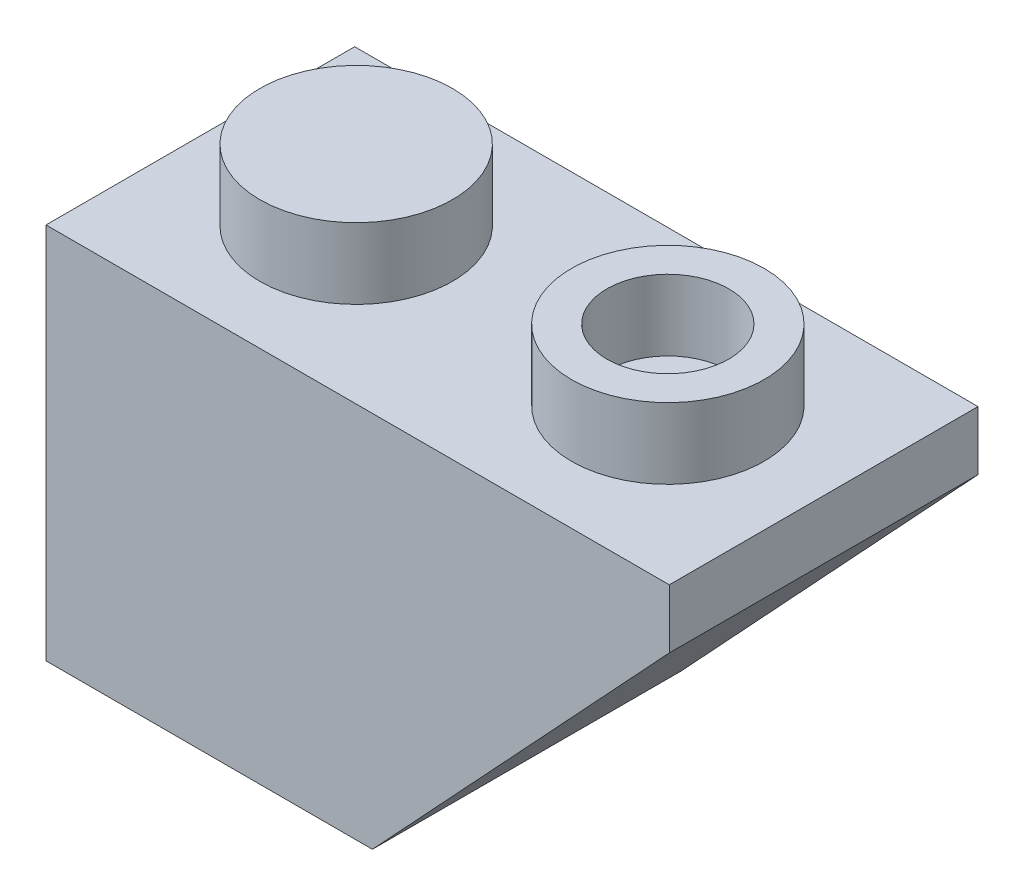
ISO-10303-21;
HEADER;
FILE_DESCRIPTION(('STEP AP214'),'2;1');
FILE_NAME('part.step','',(''),(''),'','','');
FILE_SCHEMA(('AUTOMOTIVE_DESIGN { 1 0 10303 214 1 1 1 1 }'));
ENDSEC;
DATA;
#1=APPLICATION_CONTEXT('core data for automotive mechanical design processes');
#2=APPLICATION_PROTOCOL_DEFINITION('international standard','automotive_design',2000,#1);
#3=PRODUCT_CONTEXT('',#1,'mechanical');
#4=PRODUCT('Part','Part','',(#3));
#5=PRODUCT_RELATED_PRODUCT_CATEGORY('part','',(#4));
#6=PRODUCT_DEFINITION_FORMATION('','',#4);
#7=PRODUCT_DEFINITION_CONTEXT('part definition',#1,'design');
#8=PRODUCT_DEFINITION('design','',#6,#7);
#9=PRODUCT_DEFINITION_SHAPE('','',#8);
#10=(LENGTH_UNIT() NAMED_UNIT(*) SI_UNIT(.MILLI.,.METRE.));
#11=(NAMED_UNIT(*) PLANE_ANGLE_UNIT() SI_UNIT($,.RADIAN.));
#12=(NAMED_UNIT(*) SI_UNIT($,.STERADIAN.) SOLID_ANGLE_UNIT());
#13=UNCERTAINTY_MEASURE_WITH_UNIT(LENGTH_MEASURE(1.E-05),#10,'distance_accuracy_value','');
#14=(GEOMETRIC_REPRESENTATION_CONTEXT(3) GLOBAL_UNCERTAINTY_ASSIGNED_CONTEXT((#13)) GLOBAL_UNIT_ASSIGNED_CONTEXT((#10,
#11,#12)) REPRESENTATION_CONTEXT('',''));
#15=CARTESIAN_POINT('',(0.,0.,0.));
#16=DIRECTION('',(0.,0.,1.));
#17=DIRECTION('',(1.,0.,0.));
#18=AXIS2_PLACEMENT_3D('',#15,#16,#17);
#19=CARTESIAN_POINT('',(15.85,9.6,-7.85));
#20=DIRECTION('',(0.,1.,0.));
#21=DIRECTION('',(0.,0.,1.));
#22=AXIS2_PLACEMENT_3D('',#19,#20,#21);
#23=PLANE('',#22);
#24=CARTESIAN_POINT('',(11.8875,9.6,-3.925));
#25=DIRECTION('',(0.,1.,0.));
#26=DIRECTION('',(0.,0.,1.));
#27=AXIS2_PLACEMENT_3D('',#24,#25,#26);
#28=CIRCLE('',#27,2.45);
#29=CARTESIAN_POINT('',(11.8875,9.6,-1.475));
#30=VERTEX_POINT('',#29);
#31=EDGE_CURVE('E225',#30,#30,#28,.T.);
#32=ORIENTED_EDGE('',*,*,#31,.F.);
#33=EDGE_LOOP('',(#32));
#34=FACE_BOUND('',#33,.T.);
#35=CARTESIAN_POINT('',(3.9625,9.6,-3.925));
#36=DIRECTION('',(0.,1.,0.));
#37=DIRECTION('',(0.,0.,1.));
#38=AXIS2_PLACEMENT_3D('',#35,#36,#37);
#39=CIRCLE('',#38,2.45);
#40=CARTESIAN_POINT('',(3.9625,9.6,-1.475));
#41=VERTEX_POINT('',#40);
#42=EDGE_CURVE('E232',#41,#41,#39,.T.);
#43=ORIENTED_EDGE('',*,*,#42,.F.);
#44=EDGE_LOOP('',(#43));
#45=FACE_BOUND('',#44,.T.);
#46=DIRECTION('',(-1.,0.,0.));
#47=VECTOR('',#46,1.);
#48=CARTESIAN_POINT('',(15.85,9.6,0.));
#49=LINE('',#48,#47);
#50=CARTESIAN_POINT('',(15.85,9.6,0.));
#51=VERTEX_POINT('',#50);
#52=CARTESIAN_POINT('',(0.,9.6,0.));
#53=VERTEX_POINT('',#52);
#54=EDGE_CURVE('E126',#51,#53,#49,.T.);
#55=ORIENTED_EDGE('',*,*,#54,.F.);
#56=DIRECTION('',(0.,0.,1.));
#57=VECTOR('',#56,1.);
#58=CARTESIAN_POINT('',(15.85,9.6,-7.85));
#59=LINE('',#58,#57);
#60=CARTESIAN_POINT('',(15.85,9.6,-7.85));
#61=VERTEX_POINT('',#60);
#62=EDGE_CURVE('E42',#61,#51,#59,.T.);
#63=ORIENTED_EDGE('',*,*,#62,.F.);
#64=DIRECTION('',(-1.,0.,0.));
#65=VECTOR('',#64,1.);
#66=CARTESIAN_POINT('',(15.85,9.6,-7.85));
#67=LINE('',#66,#65);
#68=CARTESIAN_POINT('',(0.,9.6,-7.85));
#69=VERTEX_POINT('',#68);
#70=EDGE_CURVE('E121',#61,#69,#67,.T.);
#71=ORIENTED_EDGE('',*,*,#70,.T.);
#72=DIRECTION('',(0.,0.,1.));
#73=VECTOR('',#72,1.);
#74=CARTESIAN_POINT('',(0.,9.6,-7.85));
#75=LINE('',#74,#73);
#76=EDGE_CURVE('E87',#69,#53,#75,.T.);
#77=ORIENTED_EDGE('',*,*,#76,.T.);
#78=EDGE_LOOP('',(#55,#63,#71,#77));
#79=FACE_BOUND('',#78,.T.);
#80=ADVANCED_FACE('F35',(#34,#45,#79),#23,.T.);
#81=CARTESIAN_POINT('',(15.85,8.1,-7.85));
#82=DIRECTION('',(1.,0.,0.));
#83=DIRECTION('',(0.,0.,-1.));
#84=AXIS2_PLACEMENT_3D('',#81,#82,#83);
#85=PLANE('',#84);
#86=DIRECTION('',(0.,1.,0.));
#87=VECTOR('',#86,1.);
#88=CARTESIAN_POINT('',(15.85,8.1,0.));
#89=LINE('',#88,#87);
#90=CARTESIAN_POINT('',(15.85,8.1,0.));
#91=VERTEX_POINT('',#90);
#92=EDGE_CURVE('E136',#91,#51,#89,.T.);
#93=ORIENTED_EDGE('',*,*,#92,.F.);
#94=DIRECTION('',(0.,0.,1.));
#95=VECTOR('',#94,1.);
#96=CARTESIAN_POINT('',(15.85,8.1,-7.85));
#97=LINE('',#96,#95);
#98=CARTESIAN_POINT('',(15.85,8.1,-7.85));
#99=VERTEX_POINT('',#98);
#100=EDGE_CURVE('E109',#99,#91,#97,.T.);
#101=ORIENTED_EDGE('',*,*,#100,.F.);
#102=DIRECTION('',(0.,1.,0.));
#103=VECTOR('',#102,1.);
#104=CARTESIAN_POINT('',(15.85,8.1,-7.85));
#105=LINE('',#104,#103);
#106=EDGE_CURVE('E116',#99,#61,#105,.T.);
#107=ORIENTED_EDGE('',*,*,#106,.T.);
#108=ORIENTED_EDGE('',*,*,#62,.T.);
#109=EDGE_LOOP('',(#93,#101,#107,#108));
#110=FACE_BOUND('',#109,.T.);
#111=ADVANCED_FACE('F144',(#110),#85,.T.);
#112=CARTESIAN_POINT('',(8.3,0.,-7.85));
#113=DIRECTION('',(0.731505583015936,-0.681835450835841,0.));
#114=DIRECTION('',(0.681835450835842,0.731505583015936,0.));
#115=AXIS2_PLACEMENT_3D('',#112,#113,#114);
#116=PLANE('',#115);
#117=DIRECTION('',(0.681835450835842,0.731505583015936,0.));
#118=VECTOR('',#117,1.);
#119=CARTESIAN_POINT('',(8.3,0.,0.));
#120=LINE('',#119,#118);
#121=CARTESIAN_POINT('',(8.3,0.,0.));
#122=VERTEX_POINT('',#121);
#123=EDGE_CURVE('E104',#122,#91,#120,.T.);
#124=ORIENTED_EDGE('',*,*,#123,.F.);
#125=DIRECTION('',(0.,0.,1.));
#126=VECTOR('',#125,1.);
#127=CARTESIAN_POINT('',(8.3,0.,-7.85));
#128=LINE('',#127,#126);
#129=CARTESIAN_POINT('',(8.3,0.,-7.85));
#130=VERTEX_POINT('',#129);
#131=EDGE_CURVE('E98',#130,#122,#128,.T.);
#132=ORIENTED_EDGE('',*,*,#131,.F.);
#133=DIRECTION('',(0.681835450835842,0.731505583015936,0.));
#134=VECTOR('',#133,1.);
#135=CARTESIAN_POINT('',(8.3,0.,-7.85));
#136=LINE('',#135,#134);
#137=EDGE_CURVE('E101',#130,#99,#136,.T.);
#138=ORIENTED_EDGE('',*,*,#137,.T.);
#139=ORIENTED_EDGE('',*,*,#100,.T.);
#140=EDGE_LOOP('',(#124,#132,#138,#139));
#141=FACE_BOUND('',#140,.T.);
#142=ADVANCED_FACE('F100',(#141),#116,.T.);
#143=CARTESIAN_POINT('',(0.,0.,-7.85));
#144=DIRECTION('',(0.,-1.,0.));
#145=DIRECTION('',(0.,0.,-1.));
#146=AXIS2_PLACEMENT_3D('',#143,#144,#145);
#147=PLANE('',#146);
#148=DIRECTION('',(0.,0.,-1.));
#149=VECTOR('',#148,1.);
#150=CARTESIAN_POINT('',(1.5,0.,-1.5));
#151=LINE('',#150,#149);
#152=CARTESIAN_POINT('',(1.5,0.,-1.5));
#153=VERTEX_POINT('',#152);
#154=CARTESIAN_POINT('',(1.5,0.,-6.35));
#155=VERTEX_POINT('',#154);
#156=EDGE_CURVE('E246',#153,#155,#151,.T.);
#157=ORIENTED_EDGE('',*,*,#156,.F.);
#158=DIRECTION('',(-1.,0.,0.));
#159=VECTOR('',#158,1.);
#160=CARTESIAN_POINT('',(1.5,0.,-1.5));
#161=LINE('',#160,#159);
#162=CARTESIAN_POINT('',(6.8,0.,-1.5));
#163=VERTEX_POINT('',#162);
#164=EDGE_CURVE('E238',#163,#153,#161,.T.);
#165=ORIENTED_EDGE('',*,*,#164,.F.);
#166=DIRECTION('',(0.,0.,1.));
#167=VECTOR('',#166,1.);
#168=CARTESIAN_POINT('',(6.8,0.,-1.5));
#169=LINE('',#168,#167);
#170=CARTESIAN_POINT('',(6.8,0.,-6.35));
#171=VERTEX_POINT('',#170);
#172=EDGE_CURVE('E49',#171,#163,#169,.T.);
#173=ORIENTED_EDGE('',*,*,#172,.F.);
#174=DIRECTION('',(1.,0.,0.));
#175=VECTOR('',#174,1.);
#176=CARTESIAN_POINT('',(1.5,0.,-6.35));
#177=LINE('',#176,#175);
#178=EDGE_CURVE('E243',#155,#171,#177,.T.);
#179=ORIENTED_EDGE('',*,*,#178,.F.);
#180=EDGE_LOOP('',(#157,#165,#173,#179));
#181=FACE_BOUND('',#180,.T.);
#182=DIRECTION('',(1.,0.,0.));
#183=VECTOR('',#182,1.);
#184=CARTESIAN_POINT('',(0.,0.,0.));
#185=LINE('',#184,#183);
#186=CARTESIAN_POINT('',(0.,0.,0.));
#187=VERTEX_POINT('',#186);
#188=EDGE_CURVE('E133',#187,#122,#185,.T.);
#189=ORIENTED_EDGE('',*,*,#188,.F.);
#190=DIRECTION('',(0.,0.,1.));
#191=VECTOR('',#190,1.);
#192=CARTESIAN_POINT('',(0.,0.,-7.85));
#193=LINE('',#192,#191);
#194=CARTESIAN_POINT('',(0.,0.,-7.85));
#195=VERTEX_POINT('',#194);
#196=EDGE_CURVE('E110',#195,#187,#193,.T.);
#197=ORIENTED_EDGE('',*,*,#196,.F.);
#198=DIRECTION('',(1.,0.,0.));
#199=VECTOR('',#198,1.);
#200=CARTESIAN_POINT('',(0.,0.,-7.85));
#201=LINE('',#200,#199);
#202=EDGE_CURVE('E115',#195,#130,#201,.T.);
#203=ORIENTED_EDGE('',*,*,#202,.T.);
#204=ORIENTED_EDGE('',*,*,#131,.T.);
#205=EDGE_LOOP('',(#189,#197,#203,#204));
#206=FACE_BOUND('',#205,.T.);
#207=ADVANCED_FACE('F118',(#181,#206),#147,.T.);
#208=CARTESIAN_POINT('',(0.,9.6,-7.85));
#209=DIRECTION('',(-1.,0.,0.));
#210=DIRECTION('',(0.,0.,1.));
#211=AXIS2_PLACEMENT_3D('',#208,#209,#210);
#212=PLANE('',#211);
#213=DIRECTION('',(0.,-1.,0.));
#214=VECTOR('',#213,1.);
#215=CARTESIAN_POINT('',(0.,9.6,0.));
#216=LINE('',#215,#214);
#217=EDGE_CURVE('E129',#53,#187,#216,.T.);
#218=ORIENTED_EDGE('',*,*,#217,.F.);
#219=ORIENTED_EDGE('',*,*,#76,.F.);
#220=DIRECTION('',(0.,-1.,0.));
#221=VECTOR('',#220,1.);
#222=CARTESIAN_POINT('',(0.,9.6,-7.85));
#223=LINE('',#222,#221);
#224=EDGE_CURVE('E119',#69,#195,#223,.T.);
#225=ORIENTED_EDGE('',*,*,#224,.T.);
#226=ORIENTED_EDGE('',*,*,#196,.T.);
#227=EDGE_LOOP('',(#218,#219,#225,#226));
#228=FACE_BOUND('',#227,.T.);
#229=ADVANCED_FACE('F141',(#228),#212,.T.);
#230=CARTESIAN_POINT('',(0.,0.,-7.85));
#231=DIRECTION('',(0.,0.,1.));
#232=DIRECTION('',(1.,0.,0.));
#233=AXIS2_PLACEMENT_3D('',#230,#231,#232);
#234=PLANE('',#233);
#235=ORIENTED_EDGE('',*,*,#70,.F.);
#236=ORIENTED_EDGE('',*,*,#106,.F.);
#237=ORIENTED_EDGE('',*,*,#137,.F.);
#238=ORIENTED_EDGE('',*,*,#202,.F.);
#239=ORIENTED_EDGE('',*,*,#224,.F.);
#240=EDGE_LOOP('',(#235,#236,#237,#238,#239));
#241=FACE_BOUND('',#240,.T.);
#242=ADVANCED_FACE('F114',(#241),#234,.F.);
#243=CARTESIAN_POINT('',(0.,0.,0.));
#244=DIRECTION('',(0.,0.,1.));
#245=DIRECTION('',(1.,0.,0.));
#246=AXIS2_PLACEMENT_3D('',#243,#244,#245);
#247=PLANE('',#246);
#248=ORIENTED_EDGE('',*,*,#54,.T.);
#249=ORIENTED_EDGE('',*,*,#217,.T.);
#250=ORIENTED_EDGE('',*,*,#188,.T.);
#251=ORIENTED_EDGE('',*,*,#123,.T.);
#252=ORIENTED_EDGE('',*,*,#92,.T.);
#253=EDGE_LOOP('',(#248,#249,#250,#251,#252));
#254=FACE_BOUND('',#253,.T.);
#255=ADVANCED_FACE('F143',(#254),#247,.T.);
#256=CARTESIAN_POINT('',(15.85,8.1,-7.85));
#257=DIRECTION('',(0.,1.,0.));
#258=DIRECTION('',(0.,0.,1.));
#259=AXIS2_PLACEMENT_3D('',#256,#257,#258);
#260=PLANE('',#259);
#261=CARTESIAN_POINT('',(3.9625,8.1,-3.925));
#262=DIRECTION('',(0.,-1.,0.));
#263=DIRECTION('',(0.,0.,-1.));
#264=AXIS2_PLACEMENT_3D('',#261,#262,#263);
#265=CIRCLE('',#264,0.95);
#266=CARTESIAN_POINT('',(3.9625,8.1,-4.875));
#267=VERTEX_POINT('',#266);
#268=EDGE_CURVE('E218',#267,#267,#265,.T.);
#269=ORIENTED_EDGE('',*,*,#268,.F.);
#270=EDGE_LOOP('',(#269));
#271=FACE_BOUND('',#270,.T.);
#272=DIRECTION('',(-1.,0.,0.));
#273=VECTOR('',#272,1.);
#274=CARTESIAN_POINT('',(1.5,8.1,-1.5));
#275=LINE('',#274,#273);
#276=CARTESIAN_POINT('',(6.8,8.1,-1.5));
#277=VERTEX_POINT('',#276);
#278=CARTESIAN_POINT('',(1.5,8.1,-1.5));
#279=VERTEX_POINT('',#278);
#280=EDGE_CURVE('E254',#277,#279,#275,.T.);
#281=ORIENTED_EDGE('',*,*,#280,.T.);
#282=DIRECTION('',(0.,0.,-1.));
#283=VECTOR('',#282,1.);
#284=CARTESIAN_POINT('',(1.5,8.1,-1.5));
#285=LINE('',#284,#283);
#286=CARTESIAN_POINT('',(1.5,8.1,-6.35));
#287=VERTEX_POINT('',#286);
#288=EDGE_CURVE('E242',#279,#287,#285,.T.);
#289=ORIENTED_EDGE('',*,*,#288,.T.);
#290=DIRECTION('',(1.,0.,0.));
#291=VECTOR('',#290,1.);
#292=CARTESIAN_POINT('',(1.5,8.1,-6.35));
#293=LINE('',#292,#291);
#294=CARTESIAN_POINT('',(6.8,8.1,-6.35));
#295=VERTEX_POINT('',#294);
#296=EDGE_CURVE('E262',#287,#295,#293,.T.);
#297=ORIENTED_EDGE('',*,*,#296,.T.);
#298=DIRECTION('',(0.,0.,1.));
#299=VECTOR('',#298,1.);
#300=CARTESIAN_POINT('',(6.8,8.1,-1.5));
#301=LINE('',#300,#299);
#302=EDGE_CURVE('E258',#295,#277,#301,.T.);
#303=ORIENTED_EDGE('',*,*,#302,.T.);
#304=EDGE_LOOP('',(#281,#289,#297,#303));
#305=FACE_BOUND('',#304,.T.);
#306=ADVANCED_FACE('F166',(#271,#305),#260,.F.);
#307=CARTESIAN_POINT('',(1.5,16.7841840176877,-1.5));
#308=DIRECTION('',(-1.,0.,0.));
#309=DIRECTION('',(0.,0.,1.));
#310=AXIS2_PLACEMENT_3D('',#307,#308,#309);
#311=PLANE('',#310);
#312=DIRECTION('',(0.,-1.,0.));
#313=VECTOR('',#312,1.);
#314=CARTESIAN_POINT('',(1.5,16.7841840176877,-1.5));
#315=LINE('',#314,#313);
#316=EDGE_CURVE('E130',#279,#153,#315,.T.);
#317=ORIENTED_EDGE('',*,*,#316,.T.);
#318=ORIENTED_EDGE('',*,*,#156,.T.);
#319=DIRECTION('',(0.,-1.,0.));
#320=VECTOR('',#319,1.);
#321=CARTESIAN_POINT('',(1.5,16.7841840176877,-6.35));
#322=LINE('',#321,#320);
#323=EDGE_CURVE('E253',#287,#155,#322,.T.);
#324=ORIENTED_EDGE('',*,*,#323,.F.);
#325=ORIENTED_EDGE('',*,*,#288,.F.);
#326=EDGE_LOOP('',(#317,#318,#324,#325));
#327=FACE_BOUND('',#326,.T.);
#328=ADVANCED_FACE('F170',(#327),#311,.F.);
#329=CARTESIAN_POINT('',(1.5,16.7841840176877,-6.35));
#330=DIRECTION('',(0.,0.,-1.));
#331=DIRECTION('',(-1.,0.,0.));
#332=AXIS2_PLACEMENT_3D('',#329,#330,#331);
#333=PLANE('',#332);
#334=ORIENTED_EDGE('',*,*,#323,.T.);
#335=ORIENTED_EDGE('',*,*,#178,.T.);
#336=DIRECTION('',(0.,-1.,0.));
#337=VECTOR('',#336,1.);
#338=CARTESIAN_POINT('',(6.8,16.7841840176877,-6.35));
#339=LINE('',#338,#337);
#340=EDGE_CURVE('E261',#295,#171,#339,.T.);
#341=ORIENTED_EDGE('',*,*,#340,.F.);
#342=ORIENTED_EDGE('',*,*,#296,.F.);
#343=EDGE_LOOP('',(#334,#335,#341,#342));
#344=FACE_BOUND('',#343,.T.);
#345=ADVANCED_FACE('F174',(#344),#333,.F.);
#346=CARTESIAN_POINT('',(6.8,16.7841840176877,-1.5));
#347=DIRECTION('',(1.,0.,0.));
#348=DIRECTION('',(0.,0.,-1.));
#349=AXIS2_PLACEMENT_3D('',#346,#347,#348);
#350=PLANE('',#349);
#351=ORIENTED_EDGE('',*,*,#340,.T.);
#352=ORIENTED_EDGE('',*,*,#172,.T.);
#353=DIRECTION('',(0.,-1.,0.));
#354=VECTOR('',#353,1.);
#355=CARTESIAN_POINT('',(6.8,16.7841840176877,-1.5));
#356=LINE('',#355,#354);
#357=EDGE_CURVE('E257',#277,#163,#356,.T.);
#358=ORIENTED_EDGE('',*,*,#357,.F.);
#359=ORIENTED_EDGE('',*,*,#302,.F.);
#360=EDGE_LOOP('',(#351,#352,#358,#359));
#361=FACE_BOUND('',#360,.T.);
#362=ADVANCED_FACE('F178',(#361),#350,.F.);
#363=CARTESIAN_POINT('',(1.5,16.7841840176877,-1.5));
#364=DIRECTION('',(0.,0.,1.));
#365=DIRECTION('',(1.,0.,0.));
#366=AXIS2_PLACEMENT_3D('',#363,#364,#365);
#367=PLANE('',#366);
#368=ORIENTED_EDGE('',*,*,#357,.T.);
#369=ORIENTED_EDGE('',*,*,#164,.T.);
#370=ORIENTED_EDGE('',*,*,#316,.F.);
#371=ORIENTED_EDGE('',*,*,#280,.F.);
#372=EDGE_LOOP('',(#368,#369,#370,#371));
#373=FACE_BOUND('',#372,.T.);
#374=ADVANCED_FACE('F182',(#373),#367,.F.);
#375=CARTESIAN_POINT('',(3.9625,11.4,-3.925));
#376=DIRECTION('',(0.,-1.,0.));
#377=DIRECTION('',(0.,0.,-1.));
#378=AXIS2_PLACEMENT_3D('',#375,#376,#377);
#379=CYLINDRICAL_SURFACE('',#378,2.45);
#380=CARTESIAN_POINT('',(3.9625,11.4,-3.925));
#381=DIRECTION('',(0.,1.,0.));
#382=DIRECTION('',(0.,0.,1.));
#383=AXIS2_PLACEMENT_3D('',#380,#381,#382);
#384=CIRCLE('',#383,2.45);
#385=CARTESIAN_POINT('',(3.9625,11.4,-1.475));
#386=VERTEX_POINT('',#385);
#387=EDGE_CURVE('E235',#386,#386,#384,.T.);
#388=ORIENTED_EDGE('',*,*,#387,.F.);
#389=EDGE_LOOP('',(#388));
#390=FACE_BOUND('',#389,.T.);
#391=ORIENTED_EDGE('',*,*,#42,.T.);
#392=EDGE_LOOP('',(#391));
#393=FACE_BOUND('',#392,.T.);
#394=ADVANCED_FACE('F185',(#390,#393),#379,.T.);
#395=CARTESIAN_POINT('',(3.9625,11.4,-3.925));
#396=DIRECTION('',(0.,1.,0.));
#397=DIRECTION('',(0.,0.,1.));
#398=AXIS2_PLACEMENT_3D('',#395,#396,#397);
#399=PLANE('',#398);
#400=ORIENTED_EDGE('',*,*,#387,.T.);
#401=EDGE_LOOP('',(#400));
#402=FACE_BOUND('',#401,.T.);
#403=ADVANCED_FACE('F189',(#402),#399,.T.);
#404=CARTESIAN_POINT('',(11.8875,11.4,-3.925));
#405=DIRECTION('',(0.,1.,0.));
#406=DIRECTION('',(0.,0.,1.));
#407=AXIS2_PLACEMENT_3D('',#404,#405,#406);
#408=PLANE('',#407);
#409=CARTESIAN_POINT('',(11.8875,11.4,-3.925));
#410=DIRECTION('',(0.,1.,0.));
#411=DIRECTION('',(0.,0.,1.));
#412=AXIS2_PLACEMENT_3D('',#409,#410,#411);
#413=CIRCLE('',#412,2.45);
#414=CARTESIAN_POINT('',(11.8875,11.4,-1.475));
#415=VERTEX_POINT('',#414);
#416=EDGE_CURVE('E229',#415,#415,#413,.T.);
#417=ORIENTED_EDGE('',*,*,#416,.T.);
#418=EDGE_LOOP('',(#417));
#419=FACE_BOUND('',#418,.T.);
#420=CARTESIAN_POINT('',(11.8875,11.4,-3.925));
#421=DIRECTION('',(0.,1.,0.));
#422=DIRECTION('',(0.,0.,1.));
#423=AXIS2_PLACEMENT_3D('',#420,#421,#422);
#424=CIRCLE('',#423,1.55);
#425=CARTESIAN_POINT('',(11.8875,11.4,-2.375));
#426=VERTEX_POINT('',#425);
#427=EDGE_CURVE('E222',#426,#426,#424,.T.);
#428=ORIENTED_EDGE('',*,*,#427,.F.);
#429=EDGE_LOOP('',(#428));
#430=FACE_BOUND('',#429,.T.);
#431=ADVANCED_FACE('F193',(#419,#430),#408,.T.);
#432=CARTESIAN_POINT('',(11.8875,11.4,-3.925));
#433=DIRECTION('',(0.,-1.,0.));
#434=DIRECTION('',(0.,0.,-1.));
#435=AXIS2_PLACEMENT_3D('',#432,#433,#434);
#436=CYLINDRICAL_SURFACE('',#435,2.45);
#437=ORIENTED_EDGE('',*,*,#416,.F.);
#438=EDGE_LOOP('',(#437));
#439=FACE_BOUND('',#438,.T.);
#440=ORIENTED_EDGE('',*,*,#31,.T.);
#441=EDGE_LOOP('',(#440));
#442=FACE_BOUND('',#441,.T.);
#443=ADVANCED_FACE('F195',(#439,#442),#436,.T.);
#444=CARTESIAN_POINT('',(11.8875,11.4,-3.925));
#445=DIRECTION('',(0.,-1.,0.));
#446=DIRECTION('',(0.,0.,-1.));
#447=AXIS2_PLACEMENT_3D('',#444,#445,#446);
#448=CYLINDRICAL_SURFACE('',#447,1.55);
#449=ORIENTED_EDGE('',*,*,#427,.T.);
#450=EDGE_LOOP('',(#449));
#451=FACE_BOUND('',#450,.T.);
#452=CARTESIAN_POINT('',(11.8875,9.6,-3.925));
#453=DIRECTION('',(0.,1.,0.));
#454=DIRECTION('',(0.,0.,1.));
#455=AXIS2_PLACEMENT_3D('',#452,#453,#454);
#456=CIRCLE('',#455,1.55);
#457=CARTESIAN_POINT('',(11.8875,9.6,-2.375));
#458=VERTEX_POINT('',#457);
#459=EDGE_CURVE('E12',#458,#458,#456,.F.);
#460=ORIENTED_EDGE('',*,*,#459,.T.);
#461=EDGE_LOOP('',(#460));
#462=FACE_BOUND('',#461,.T.);
#463=ADVANCED_FACE('F198',(#451,#462),#448,.F.);
#464=ORIENTED_EDGE('',*,*,#459,.F.);
#465=EDGE_LOOP('',(#464));
#466=FACE_BOUND('',#465,.T.);
#467=ADVANCED_FACE('F153',(#466),#23,.T.);
#468=CARTESIAN_POINT('',(3.9625,9.9,-3.925));
#469=DIRECTION('',(0.,1.,0.));
#470=DIRECTION('',(0.,0.,1.));
#471=AXIS2_PLACEMENT_3D('',#468,#469,#470);
#472=PLANE('',#471);
#473=CARTESIAN_POINT('',(3.9625,9.9,-3.925));
#474=DIRECTION('',(0.,1.,0.));
#475=DIRECTION('',(0.,0.,1.));
#476=AXIS2_PLACEMENT_3D('',#473,#474,#475);
#477=CIRCLE('',#476,0.95);
#478=CARTESIAN_POINT('',(3.9625,9.9,-2.975));
#479=VERTEX_POINT('',#478);
#480=EDGE_CURVE('E221',#479,#479,#477,.F.);
#481=ORIENTED_EDGE('',*,*,#480,.T.);
#482=EDGE_LOOP('',(#481));
#483=FACE_BOUND('',#482,.T.);
#484=ADVANCED_FACE('F206',(#483),#472,.F.);
#485=CARTESIAN_POINT('',(3.9625,14.0870057685089,-3.925));
#486=DIRECTION('',(0.,-1.,0.));
#487=DIRECTION('',(0.,0.,-1.));
#488=AXIS2_PLACEMENT_3D('',#485,#486,#487);
#489=CYLINDRICAL_SURFACE('',#488,0.95);
#490=ORIENTED_EDGE('',*,*,#268,.T.);
#491=EDGE_LOOP('',(#490));
#492=FACE_BOUND('',#491,.T.);
#493=ORIENTED_EDGE('',*,*,#480,.F.);
#494=EDGE_LOOP('',(#493));
#495=FACE_BOUND('',#494,.T.);
#496=ADVANCED_FACE('F209',(#492,#495),#489,.F.);
#497=CLOSED_SHELL('',(#80,#111,#142,#207,#229,#242,#255,#306,#328,#345,#362,#374,#394,#403,#431,
#443,#463,#467,#484,#496));
#498=MANIFOLD_SOLID_BREP('B2',#497);
#499=ADVANCED_BREP_SHAPE_REPRESENTATION('',(#18,#498),#14);
#500=SHAPE_DEFINITION_REPRESENTATION(#9,#499);
ENDSEC;
END-ISO-10303-21;
